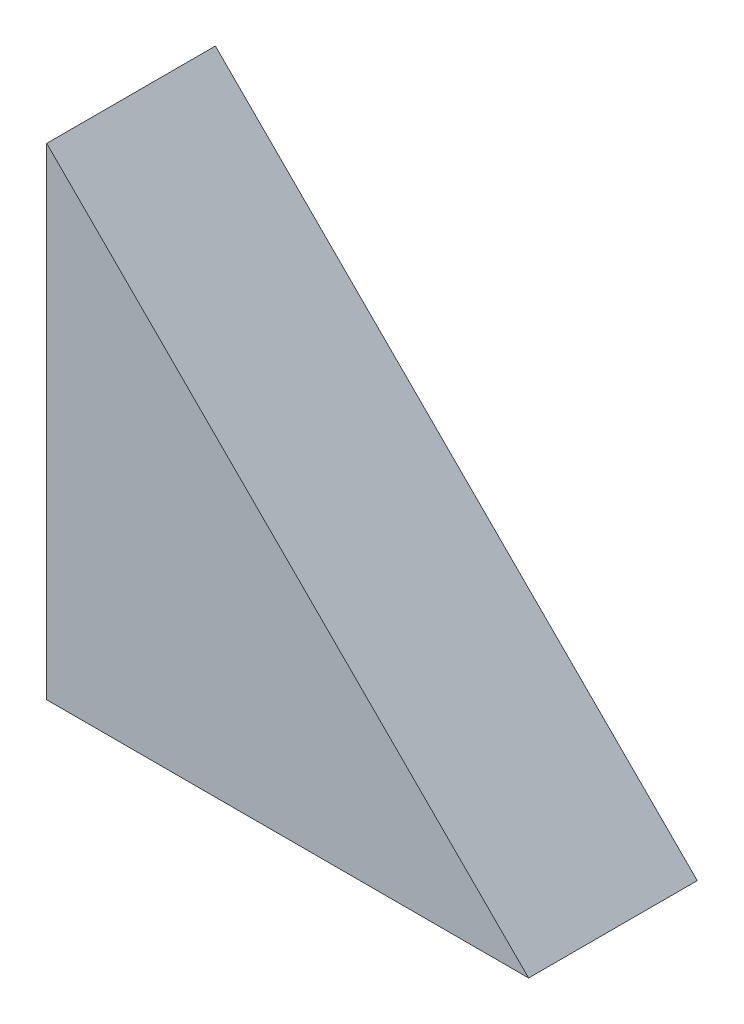
ISO-10303-21;
HEADER;
FILE_DESCRIPTION(('STEP AP214'),'2;1');
FILE_NAME('part.step','',(''),(''),'','','');
FILE_SCHEMA(('AUTOMOTIVE_DESIGN { 1 0 10303 214 1 1 1 1 }'));
ENDSEC;
DATA;
#1=APPLICATION_CONTEXT('core data for automotive mechanical design processes');
#2=APPLICATION_PROTOCOL_DEFINITION('international standard','automotive_design',2000,#1);
#3=PRODUCT_CONTEXT('',#1,'mechanical');
#4=PRODUCT('Part','Part','',(#3));
#5=PRODUCT_RELATED_PRODUCT_CATEGORY('part','',(#4));
#6=PRODUCT_DEFINITION_FORMATION('','',#4);
#7=PRODUCT_DEFINITION_CONTEXT('part definition',#1,'design');
#8=PRODUCT_DEFINITION('design','',#6,#7);
#9=PRODUCT_DEFINITION_SHAPE('','',#8);
#10=(LENGTH_UNIT() NAMED_UNIT(*) SI_UNIT(.MILLI.,.METRE.));
#11=(NAMED_UNIT(*) PLANE_ANGLE_UNIT() SI_UNIT($,.RADIAN.));
#12=(NAMED_UNIT(*) SI_UNIT($,.STERADIAN.) SOLID_ANGLE_UNIT());
#13=UNCERTAINTY_MEASURE_WITH_UNIT(LENGTH_MEASURE(1.E-05),#10,'distance_accuracy_value','');
#14=(GEOMETRIC_REPRESENTATION_CONTEXT(3) GLOBAL_UNCERTAINTY_ASSIGNED_CONTEXT((#13)) GLOBAL_UNIT_ASSIGNED_CONTEXT((#10,
#11,#12)) REPRESENTATION_CONTEXT('',''));
#15=CARTESIAN_POINT('',(0.,0.,0.));
#16=DIRECTION('',(0.,0.,1.));
#17=DIRECTION('',(1.,0.,0.));
#18=AXIS2_PLACEMENT_3D('',#15,#16,#17);
#19=CARTESIAN_POINT('',(10.,-10.,3.5));
#20=DIRECTION('',(-0.707106781186547,-0.707106781186547,0.));
#21=DIRECTION('',(0.707106781186548,-0.707106781186548,0.));
#22=AXIS2_PLACEMENT_3D('',#19,#20,#21);
#23=PLANE('',#22);
#24=DIRECTION('',(-0.707106781186548,0.707106781186548,0.));
#25=VECTOR('',#24,1.);
#26=CARTESIAN_POINT('',(10.,-10.,0.));
#27=LINE('',#26,#25);
#28=CARTESIAN_POINT('',(10.,-10.,0.));
#29=VERTEX_POINT('',#28);
#30=CARTESIAN_POINT('',(0.,0.,0.));
#31=VERTEX_POINT('',#30);
#32=EDGE_CURVE('E89',#29,#31,#27,.T.);
#33=ORIENTED_EDGE('',*,*,#32,.T.);
#34=DIRECTION('',(0.,0.,-1.));
#35=VECTOR('',#34,1.);
#36=CARTESIAN_POINT('',(0.,0.,3.5));
#37=LINE('',#36,#35);
#38=CARTESIAN_POINT('',(0.,0.,3.5));
#39=VERTEX_POINT('',#38);
#40=EDGE_CURVE('E11',#39,#31,#37,.T.);
#41=ORIENTED_EDGE('',*,*,#40,.F.);
#42=DIRECTION('',(-0.707106781186548,0.707106781186548,0.));
#43=VECTOR('',#42,1.);
#44=CARTESIAN_POINT('',(10.,-10.,3.5));
#45=LINE('',#44,#43);
#46=CARTESIAN_POINT('',(10.,-10.,3.5));
#47=VERTEX_POINT('',#46);
#48=EDGE_CURVE('E81',#47,#39,#45,.T.);
#49=ORIENTED_EDGE('',*,*,#48,.F.);
#50=DIRECTION('',(0.,0.,-1.));
#51=VECTOR('',#50,1.);
#52=CARTESIAN_POINT('',(10.,-10.,3.5));
#53=LINE('',#52,#51);
#54=EDGE_CURVE('E90',#47,#29,#53,.T.);
#55=ORIENTED_EDGE('',*,*,#54,.T.);
#56=EDGE_LOOP('',(#33,#41,#49,#55));
#57=FACE_BOUND('',#56,.T.);
#58=ADVANCED_FACE('F39',(#57),#23,.F.);
#59=CARTESIAN_POINT('',(0.,0.,3.5));
#60=DIRECTION('',(1.,0.,0.));
#61=DIRECTION('',(0.,1.,0.));
#62=AXIS2_PLACEMENT_3D('',#59,#60,#61);
#63=PLANE('',#62);
#64=DIRECTION('',(0.,-1.,0.));
#65=VECTOR('',#64,1.);
#66=CARTESIAN_POINT('',(0.,0.,0.));
#67=LINE('',#66,#65);
#68=CARTESIAN_POINT('',(0.,-10.,0.));
#69=VERTEX_POINT('',#68);
#70=EDGE_CURVE('E68',#31,#69,#67,.T.);
#71=ORIENTED_EDGE('',*,*,#70,.T.);
#72=DIRECTION('',(0.,0.,-1.));
#73=VECTOR('',#72,1.);
#74=CARTESIAN_POINT('',(0.,-10.,3.5));
#75=LINE('',#74,#73);
#76=CARTESIAN_POINT('',(0.,-10.,3.5));
#77=VERTEX_POINT('',#76);
#78=EDGE_CURVE('E48',#77,#69,#75,.T.);
#79=ORIENTED_EDGE('',*,*,#78,.F.);
#80=DIRECTION('',(0.,-1.,0.));
#81=VECTOR('',#80,1.);
#82=CARTESIAN_POINT('',(0.,0.,3.5));
#83=LINE('',#82,#81);
#84=EDGE_CURVE('E76',#39,#77,#83,.T.);
#85=ORIENTED_EDGE('',*,*,#84,.F.);
#86=ORIENTED_EDGE('',*,*,#40,.T.);
#87=EDGE_LOOP('',(#71,#79,#85,#86));
#88=FACE_BOUND('',#87,.T.);
#89=ADVANCED_FACE('F77',(#88),#63,.F.);
#90=CARTESIAN_POINT('',(0.,-10.,3.5));
#91=DIRECTION('',(0.,1.,0.));
#92=DIRECTION('',(0.,0.,1.));
#93=AXIS2_PLACEMENT_3D('',#90,#91,#92);
#94=PLANE('',#93);
#95=DIRECTION('',(1.,0.,0.));
#96=VECTOR('',#95,1.);
#97=CARTESIAN_POINT('',(0.,-10.,0.));
#98=LINE('',#97,#96);
#99=EDGE_CURVE('E73',#69,#29,#98,.T.);
#100=ORIENTED_EDGE('',*,*,#99,.T.);
#101=ORIENTED_EDGE('',*,*,#54,.F.);
#102=DIRECTION('',(1.,0.,0.));
#103=VECTOR('',#102,1.);
#104=CARTESIAN_POINT('',(0.,-10.,3.5));
#105=LINE('',#104,#103);
#106=EDGE_CURVE('E56',#77,#47,#105,.T.);
#107=ORIENTED_EDGE('',*,*,#106,.F.);
#108=ORIENTED_EDGE('',*,*,#78,.T.);
#109=EDGE_LOOP('',(#100,#101,#107,#108));
#110=FACE_BOUND('',#109,.T.);
#111=ADVANCED_FACE('F102',(#110),#94,.F.);
#112=CARTESIAN_POINT('',(0.,0.,3.5));
#113=DIRECTION('',(0.,0.,1.));
#114=DIRECTION('',(1.,0.,0.));
#115=AXIS2_PLACEMENT_3D('',#112,#113,#114);
#116=PLANE('',#115);
#117=ORIENTED_EDGE('',*,*,#48,.T.);
#118=ORIENTED_EDGE('',*,*,#84,.T.);
#119=ORIENTED_EDGE('',*,*,#106,.T.);
#120=EDGE_LOOP('',(#117,#118,#119));
#121=FACE_BOUND('',#120,.T.);
#122=ADVANCED_FACE('F84',(#121),#116,.T.);
#123=CARTESIAN_POINT('',(0.,0.,0.));
#124=DIRECTION('',(0.,0.,1.));
#125=DIRECTION('',(1.,0.,0.));
#126=AXIS2_PLACEMENT_3D('',#123,#124,#125);
#127=PLANE('',#126);
#128=ORIENTED_EDGE('',*,*,#32,.F.);
#129=ORIENTED_EDGE('',*,*,#99,.F.);
#130=ORIENTED_EDGE('',*,*,#70,.F.);
#131=EDGE_LOOP('',(#128,#129,#130));
#132=FACE_BOUND('',#131,.T.);
#133=ADVANCED_FACE('F103',(#132),#127,.F.);
#134=CLOSED_SHELL('',(#58,#89,#111,#122,#133));
#135=MANIFOLD_SOLID_BREP('B2',#134);
#136=ADVANCED_BREP_SHAPE_REPRESENTATION('',(#18,#135),#14);
#137=SHAPE_DEFINITION_REPRESENTATION(#9,#136);
ENDSEC;
END-ISO-10303-21;
